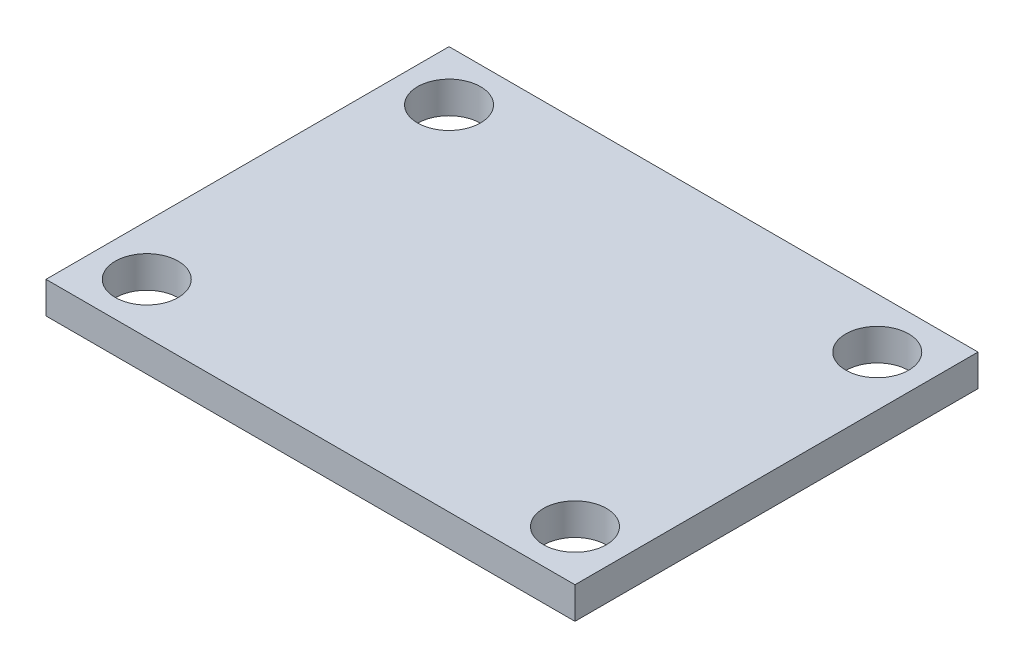
ISO-10303-21;
HEADER;
FILE_DESCRIPTION(('STEP AP214'),'2;1');
FILE_NAME('part.step','',(''),(''),'','','');
FILE_SCHEMA(('AUTOMOTIVE_DESIGN { 1 0 10303 214 1 1 1 1 }'));
ENDSEC;
DATA;
#1=APPLICATION_CONTEXT('core data for automotive mechanical design processes');
#2=APPLICATION_PROTOCOL_DEFINITION('international standard','automotive_design',2000,#1);
#3=PRODUCT_CONTEXT('',#1,'mechanical');
#4=PRODUCT('Part','Part','',(#3));
#5=PRODUCT_RELATED_PRODUCT_CATEGORY('part','',(#4));
#6=PRODUCT_DEFINITION_FORMATION('','',#4);
#7=PRODUCT_DEFINITION_CONTEXT('part definition',#1,'design');
#8=PRODUCT_DEFINITION('design','',#6,#7);
#9=PRODUCT_DEFINITION_SHAPE('','',#8);
#10=(LENGTH_UNIT() NAMED_UNIT(*) SI_UNIT(.MILLI.,.METRE.));
#11=(NAMED_UNIT(*) PLANE_ANGLE_UNIT() SI_UNIT($,.RADIAN.));
#12=(NAMED_UNIT(*) SI_UNIT($,.STERADIAN.) SOLID_ANGLE_UNIT());
#13=UNCERTAINTY_MEASURE_WITH_UNIT(LENGTH_MEASURE(1.E-05),#10,'distance_accuracy_value','');
#14=(GEOMETRIC_REPRESENTATION_CONTEXT(3) GLOBAL_UNCERTAINTY_ASSIGNED_CONTEXT((#13)) GLOBAL_UNIT_ASSIGNED_CONTEXT((#10,
#11,#12)) REPRESENTATION_CONTEXT('',''));
#15=CARTESIAN_POINT('',(0.,0.,0.));
#16=DIRECTION('',(0.,0.,1.));
#17=DIRECTION('',(1.,0.,0.));
#18=AXIS2_PLACEMENT_3D('',#15,#16,#17);
#19=CARTESIAN_POINT('',(0.,1.6002,0.));
#20=DIRECTION('',(0.,-1.,0.));
#21=DIRECTION('',(0.,0.,-1.));
#22=AXIS2_PLACEMENT_3D('',#19,#20,#21);
#23=PLANE('',#22);
#24=DIRECTION('',(0.,0.,-1.));
#25=VECTOR('',#24,1.);
#26=CARTESIAN_POINT('',(13.335,1.6002,10.16));
#27=LINE('',#26,#25);
#28=CARTESIAN_POINT('',(13.335,1.6002,10.16));
#29=VERTEX_POINT('',#28);
#30=CARTESIAN_POINT('',(13.335,1.6002,-10.16));
#31=VERTEX_POINT('',#30);
#32=EDGE_CURVE('E85',#29,#31,#27,.T.);
#33=ORIENTED_EDGE('',*,*,#32,.T.);
#34=DIRECTION('',(-1.,0.,0.));
#35=VECTOR('',#34,1.);
#36=CARTESIAN_POINT('',(-13.335,1.6002,-10.16));
#37=LINE('',#36,#35);
#38=CARTESIAN_POINT('',(-13.335,1.6002,-10.16));
#39=VERTEX_POINT('',#38);
#40=EDGE_CURVE('E80',#31,#39,#37,.T.);
#41=ORIENTED_EDGE('',*,*,#40,.T.);
#42=DIRECTION('',(0.,0.,1.));
#43=VECTOR('',#42,1.);
#44=CARTESIAN_POINT('',(-13.335,1.6002,10.16));
#45=LINE('',#44,#43);
#46=CARTESIAN_POINT('',(-13.335,1.6002,10.16));
#47=VERTEX_POINT('',#46);
#48=EDGE_CURVE('E83',#39,#47,#45,.T.);
#49=ORIENTED_EDGE('',*,*,#48,.T.);
#50=DIRECTION('',(1.,0.,0.));
#51=VECTOR('',#50,1.);
#52=CARTESIAN_POINT('',(-13.335,1.6002,10.16));
#53=LINE('',#52,#51);
#54=EDGE_CURVE('E50',#47,#29,#53,.T.);
#55=ORIENTED_EDGE('',*,*,#54,.T.);
#56=EDGE_LOOP('',(#33,#41,#49,#55));
#57=FACE_BOUND('',#56,.T.);
#58=CARTESIAN_POINT('',(-10.795,1.6002,-7.62));
#59=DIRECTION('',(0.,1.,0.));
#60=DIRECTION('',(0.,0.,1.));
#61=AXIS2_PLACEMENT_3D('',#58,#59,#60);
#62=CIRCLE('',#61,1.5875);
#63=CARTESIAN_POINT('',(-10.795,1.6002,-6.0325));
#64=VERTEX_POINT('',#63);
#65=EDGE_CURVE('E100',#64,#64,#62,.T.);
#66=ORIENTED_EDGE('',*,*,#65,.F.);
#67=EDGE_LOOP('',(#66));
#68=FACE_BOUND('',#67,.T.);
#69=CARTESIAN_POINT('',(10.795,1.6002,-7.62));
#70=DIRECTION('',(0.,1.,0.));
#71=DIRECTION('',(0.,0.,1.));
#72=AXIS2_PLACEMENT_3D('',#69,#70,#71);
#73=CIRCLE('',#72,1.5875);
#74=CARTESIAN_POINT('',(10.795,1.6002,-6.0325));
#75=VERTEX_POINT('',#74);
#76=EDGE_CURVE('E115',#75,#75,#73,.T.);
#77=ORIENTED_EDGE('',*,*,#76,.F.);
#78=EDGE_LOOP('',(#77));
#79=FACE_BOUND('',#78,.T.);
#80=CARTESIAN_POINT('',(10.795,1.6002,7.62));
#81=DIRECTION('',(0.,1.,0.));
#82=DIRECTION('',(0.,0.,1.));
#83=AXIS2_PLACEMENT_3D('',#80,#81,#82);
#84=CIRCLE('',#83,1.5875);
#85=CARTESIAN_POINT('',(10.795,1.6002,9.2075));
#86=VERTEX_POINT('',#85);
#87=EDGE_CURVE('E121',#86,#86,#84,.T.);
#88=ORIENTED_EDGE('',*,*,#87,.F.);
#89=EDGE_LOOP('',(#88));
#90=FACE_BOUND('',#89,.T.);
#91=CARTESIAN_POINT('',(-10.795,1.6002,7.62));
#92=DIRECTION('',(0.,1.,0.));
#93=DIRECTION('',(0.,0.,1.));
#94=AXIS2_PLACEMENT_3D('',#91,#92,#93);
#95=CIRCLE('',#94,1.5875);
#96=CARTESIAN_POINT('',(-10.795,1.6002,9.2075));
#97=VERTEX_POINT('',#96);
#98=EDGE_CURVE('E127',#97,#97,#95,.T.);
#99=ORIENTED_EDGE('',*,*,#98,.F.);
#100=EDGE_LOOP('',(#99));
#101=FACE_BOUND('',#100,.T.);
#102=ADVANCED_FACE('F33',(#57,#68,#79,#90,#101),#23,.F.);
#103=CARTESIAN_POINT('',(0.,0.,0.));
#104=DIRECTION('',(0.,-1.,0.));
#105=DIRECTION('',(0.,0.,-1.));
#106=AXIS2_PLACEMENT_3D('',#103,#104,#105);
#107=PLANE('',#106);
#108=CARTESIAN_POINT('',(10.795,0.,7.62));
#109=DIRECTION('',(0.,1.,0.));
#110=DIRECTION('',(0.,0.,1.));
#111=AXIS2_PLACEMENT_3D('',#108,#109,#110);
#112=CIRCLE('',#111,1.5875);
#113=CARTESIAN_POINT('',(10.795,0.,9.2075));
#114=VERTEX_POINT('',#113);
#115=EDGE_CURVE('E124',#114,#114,#112,.T.);
#116=ORIENTED_EDGE('',*,*,#115,.T.);
#117=EDGE_LOOP('',(#116));
#118=FACE_BOUND('',#117,.T.);
#119=CARTESIAN_POINT('',(-10.795,0.,-7.62));
#120=DIRECTION('',(0.,1.,0.));
#121=DIRECTION('',(0.,0.,1.));
#122=AXIS2_PLACEMENT_3D('',#119,#120,#121);
#123=CIRCLE('',#122,1.5875);
#124=CARTESIAN_POINT('',(-10.795,0.,-6.0325));
#125=VERTEX_POINT('',#124);
#126=EDGE_CURVE('E112',#125,#125,#123,.T.);
#127=ORIENTED_EDGE('',*,*,#126,.T.);
#128=EDGE_LOOP('',(#127));
#129=FACE_BOUND('',#128,.T.);
#130=DIRECTION('',(0.,0.,-1.));
#131=VECTOR('',#130,1.);
#132=CARTESIAN_POINT('',(13.335,0.,10.16));
#133=LINE('',#132,#131);
#134=CARTESIAN_POINT('',(13.335,0.,10.16));
#135=VERTEX_POINT('',#134);
#136=CARTESIAN_POINT('',(13.335,0.,-10.16));
#137=VERTEX_POINT('',#136);
#138=EDGE_CURVE('E97',#135,#137,#133,.T.);
#139=ORIENTED_EDGE('',*,*,#138,.F.);
#140=DIRECTION('',(1.,0.,0.));
#141=VECTOR('',#140,1.);
#142=CARTESIAN_POINT('',(-13.335,0.,10.16));
#143=LINE('',#142,#141);
#144=CARTESIAN_POINT('',(-13.335,0.,10.16));
#145=VERTEX_POINT('',#144);
#146=EDGE_CURVE('E73',#145,#135,#143,.T.);
#147=ORIENTED_EDGE('',*,*,#146,.F.);
#148=DIRECTION('',(0.,0.,1.));
#149=VECTOR('',#148,1.);
#150=CARTESIAN_POINT('',(-13.335,0.,10.16));
#151=LINE('',#150,#149);
#152=CARTESIAN_POINT('',(-13.335,0.,-10.16));
#153=VERTEX_POINT('',#152);
#154=EDGE_CURVE('E67',#153,#145,#151,.T.);
#155=ORIENTED_EDGE('',*,*,#154,.F.);
#156=DIRECTION('',(-1.,0.,0.));
#157=VECTOR('',#156,1.);
#158=CARTESIAN_POINT('',(-13.335,0.,-10.16));
#159=LINE('',#158,#157);
#160=EDGE_CURVE('E89',#137,#153,#159,.T.);
#161=ORIENTED_EDGE('',*,*,#160,.F.);
#162=EDGE_LOOP('',(#139,#147,#155,#161));
#163=FACE_BOUND('',#162,.T.);
#164=CARTESIAN_POINT('',(10.795,0.,-7.62));
#165=DIRECTION('',(0.,1.,0.));
#166=DIRECTION('',(0.,0.,1.));
#167=AXIS2_PLACEMENT_3D('',#164,#165,#166);
#168=CIRCLE('',#167,1.5875);
#169=CARTESIAN_POINT('',(10.795,0.,-6.0325));
#170=VERTEX_POINT('',#169);
#171=EDGE_CURVE('E118',#170,#170,#168,.T.);
#172=ORIENTED_EDGE('',*,*,#171,.T.);
#173=EDGE_LOOP('',(#172));
#174=FACE_BOUND('',#173,.T.);
#175=CARTESIAN_POINT('',(-10.795,0.,7.62));
#176=DIRECTION('',(0.,1.,0.));
#177=DIRECTION('',(0.,0.,1.));
#178=AXIS2_PLACEMENT_3D('',#175,#176,#177);
#179=CIRCLE('',#178,1.5875);
#180=CARTESIAN_POINT('',(-10.795,0.,9.2075));
#181=VERTEX_POINT('',#180);
#182=EDGE_CURVE('E130',#181,#181,#179,.T.);
#183=ORIENTED_EDGE('',*,*,#182,.T.);
#184=EDGE_LOOP('',(#183));
#185=FACE_BOUND('',#184,.T.);
#186=ADVANCED_FACE('F108',(#118,#129,#163,#174,#185),#107,.T.);
#187=CARTESIAN_POINT('',(13.335,1.6002,10.16));
#188=DIRECTION('',(-1.,0.,0.));
#189=DIRECTION('',(0.,0.,1.));
#190=AXIS2_PLACEMENT_3D('',#187,#188,#189);
#191=PLANE('',#190);
#192=ORIENTED_EDGE('',*,*,#138,.T.);
#193=DIRECTION('',(0.,-1.,0.));
#194=VECTOR('',#193,1.);
#195=CARTESIAN_POINT('',(13.335,1.6002,-10.16));
#196=LINE('',#195,#194);
#197=EDGE_CURVE('E11',#31,#137,#196,.T.);
#198=ORIENTED_EDGE('',*,*,#197,.F.);
#199=ORIENTED_EDGE('',*,*,#32,.F.);
#200=DIRECTION('',(0.,-1.,0.));
#201=VECTOR('',#200,1.);
#202=CARTESIAN_POINT('',(13.335,1.6002,10.16));
#203=LINE('',#202,#201);
#204=EDGE_CURVE('E93',#29,#135,#203,.T.);
#205=ORIENTED_EDGE('',*,*,#204,.T.);
#206=EDGE_LOOP('',(#192,#198,#199,#205));
#207=FACE_BOUND('',#206,.T.);
#208=ADVANCED_FACE('F35',(#207),#191,.F.);
#209=CARTESIAN_POINT('',(-13.335,1.6002,-10.16));
#210=DIRECTION('',(0.,0.,1.));
#211=DIRECTION('',(1.,0.,0.));
#212=AXIS2_PLACEMENT_3D('',#209,#210,#211);
#213=PLANE('',#212);
#214=ORIENTED_EDGE('',*,*,#160,.T.);
#215=DIRECTION('',(0.,-1.,0.));
#216=VECTOR('',#215,1.);
#217=CARTESIAN_POINT('',(-13.335,1.6002,-10.16));
#218=LINE('',#217,#216);
#219=EDGE_CURVE('E42',#39,#153,#218,.T.);
#220=ORIENTED_EDGE('',*,*,#219,.F.);
#221=ORIENTED_EDGE('',*,*,#40,.F.);
#222=ORIENTED_EDGE('',*,*,#197,.T.);
#223=EDGE_LOOP('',(#214,#220,#221,#222));
#224=FACE_BOUND('',#223,.T.);
#225=ADVANCED_FACE('F88',(#224),#213,.F.);
#226=CARTESIAN_POINT('',(-13.335,1.6002,10.16));
#227=DIRECTION('',(1.,0.,0.));
#228=DIRECTION('',(0.,0.,-1.));
#229=AXIS2_PLACEMENT_3D('',#226,#227,#228);
#230=PLANE('',#229);
#231=ORIENTED_EDGE('',*,*,#154,.T.);
#232=DIRECTION('',(0.,-1.,0.));
#233=VECTOR('',#232,1.);
#234=CARTESIAN_POINT('',(-13.335,1.6002,10.16));
#235=LINE('',#234,#233);
#236=EDGE_CURVE('E90',#47,#145,#235,.T.);
#237=ORIENTED_EDGE('',*,*,#236,.F.);
#238=ORIENTED_EDGE('',*,*,#48,.F.);
#239=ORIENTED_EDGE('',*,*,#219,.T.);
#240=EDGE_LOOP('',(#231,#237,#238,#239));
#241=FACE_BOUND('',#240,.T.);
#242=ADVANCED_FACE('F91',(#241),#230,.F.);
#243=CARTESIAN_POINT('',(-13.335,1.6002,10.16));
#244=DIRECTION('',(0.,0.,-1.));
#245=DIRECTION('',(-1.,0.,0.));
#246=AXIS2_PLACEMENT_3D('',#243,#244,#245);
#247=PLANE('',#246);
#248=ORIENTED_EDGE('',*,*,#146,.T.);
#249=ORIENTED_EDGE('',*,*,#204,.F.);
#250=ORIENTED_EDGE('',*,*,#54,.F.);
#251=ORIENTED_EDGE('',*,*,#236,.T.);
#252=EDGE_LOOP('',(#248,#249,#250,#251));
#253=FACE_BOUND('',#252,.T.);
#254=ADVANCED_FACE('F105',(#253),#247,.F.);
#255=CARTESIAN_POINT('',(-10.795,1.6002,-7.62));
#256=DIRECTION('',(0.,-1.,0.));
#257=DIRECTION('',(0.,0.,-1.));
#258=AXIS2_PLACEMENT_3D('',#255,#256,#257);
#259=CYLINDRICAL_SURFACE('',#258,1.5875);
#260=ORIENTED_EDGE('',*,*,#65,.T.);
#261=EDGE_LOOP('',(#260));
#262=FACE_BOUND('',#261,.T.);
#263=ORIENTED_EDGE('',*,*,#126,.F.);
#264=EDGE_LOOP('',(#263));
#265=FACE_BOUND('',#264,.T.);
#266=ADVANCED_FACE('F147',(#262,#265),#259,.F.);
#267=CARTESIAN_POINT('',(10.795,1.6002,-7.62));
#268=DIRECTION('',(0.,-1.,0.));
#269=DIRECTION('',(0.,0.,-1.));
#270=AXIS2_PLACEMENT_3D('',#267,#268,#269);
#271=CYLINDRICAL_SURFACE('',#270,1.5875);
#272=ORIENTED_EDGE('',*,*,#76,.T.);
#273=EDGE_LOOP('',(#272));
#274=FACE_BOUND('',#273,.T.);
#275=ORIENTED_EDGE('',*,*,#171,.F.);
#276=EDGE_LOOP('',(#275));
#277=FACE_BOUND('',#276,.T.);
#278=ADVANCED_FACE('F193',(#274,#277),#271,.F.);
#279=CARTESIAN_POINT('',(10.795,1.6002,7.62));
#280=DIRECTION('',(0.,-1.,0.));
#281=DIRECTION('',(0.,0.,-1.));
#282=AXIS2_PLACEMENT_3D('',#279,#280,#281);
#283=CYLINDRICAL_SURFACE('',#282,1.5875);
#284=ORIENTED_EDGE('',*,*,#87,.T.);
#285=EDGE_LOOP('',(#284));
#286=FACE_BOUND('',#285,.T.);
#287=ORIENTED_EDGE('',*,*,#115,.F.);
#288=EDGE_LOOP('',(#287));
#289=FACE_BOUND('',#288,.T.);
#290=ADVANCED_FACE('F201',(#286,#289),#283,.F.);
#291=CARTESIAN_POINT('',(-10.795,1.6002,7.62));
#292=DIRECTION('',(0.,-1.,0.));
#293=DIRECTION('',(0.,0.,-1.));
#294=AXIS2_PLACEMENT_3D('',#291,#292,#293);
#295=CYLINDRICAL_SURFACE('',#294,1.5875);
#296=ORIENTED_EDGE('',*,*,#98,.T.);
#297=EDGE_LOOP('',(#296));
#298=FACE_BOUND('',#297,.T.);
#299=ORIENTED_EDGE('',*,*,#182,.F.);
#300=EDGE_LOOP('',(#299));
#301=FACE_BOUND('',#300,.T.);
#302=ADVANCED_FACE('F136',(#298,#301),#295,.F.);
#303=CLOSED_SHELL('',(#102,#186,#208,#225,#242,#254,#266,#278,#290,#302));
#304=MANIFOLD_SOLID_BREP('B2',#303);
#305=ADVANCED_BREP_SHAPE_REPRESENTATION('',(#18,#304),#14);
#306=SHAPE_DEFINITION_REPRESENTATION(#9,#305);
ENDSEC;
END-ISO-10303-21;
